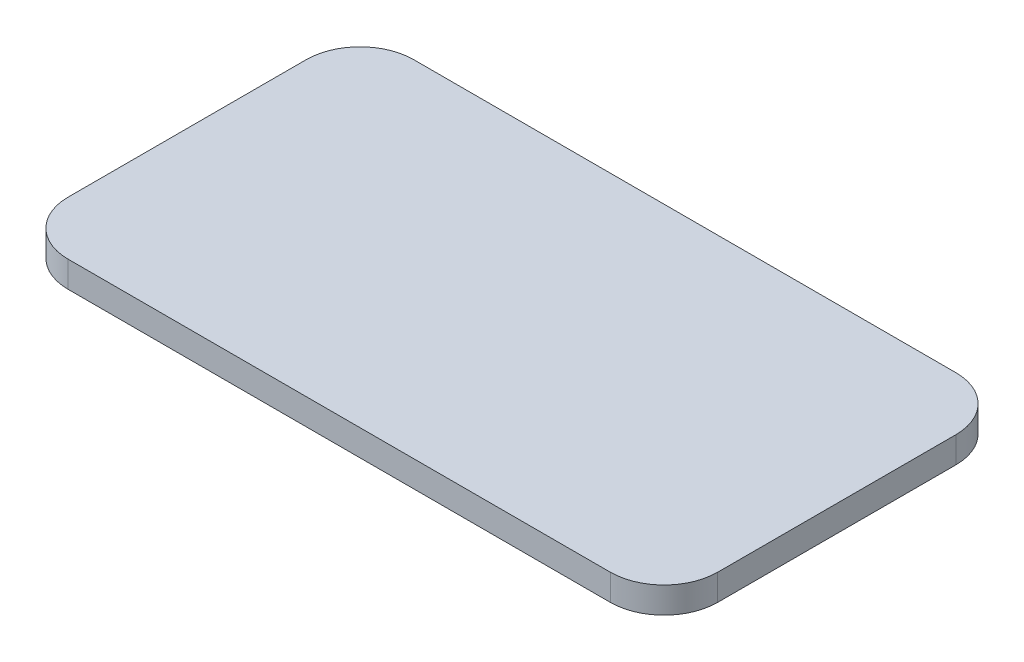
ISO-10303-21;
HEADER;
FILE_DESCRIPTION(('STEP AP214'),'2;1');
FILE_NAME('part.step','',(''),(''),'','','');
FILE_SCHEMA(('AUTOMOTIVE_DESIGN { 1 0 10303 214 1 1 1 1 }'));
ENDSEC;
DATA;
#1=APPLICATION_CONTEXT('core data for automotive mechanical design processes');
#2=APPLICATION_PROTOCOL_DEFINITION('international standard','automotive_design',2000,#1);
#3=PRODUCT_CONTEXT('',#1,'mechanical');
#4=PRODUCT('Part','Part','',(#3));
#5=PRODUCT_RELATED_PRODUCT_CATEGORY('part','',(#4));
#6=PRODUCT_DEFINITION_FORMATION('','',#4);
#7=PRODUCT_DEFINITION_CONTEXT('part definition',#1,'design');
#8=PRODUCT_DEFINITION('design','',#6,#7);
#9=PRODUCT_DEFINITION_SHAPE('','',#8);
#10=(LENGTH_UNIT() NAMED_UNIT(*) SI_UNIT(.MILLI.,.METRE.));
#11=(NAMED_UNIT(*) PLANE_ANGLE_UNIT() SI_UNIT($,.RADIAN.));
#12=(NAMED_UNIT(*) SI_UNIT($,.STERADIAN.) SOLID_ANGLE_UNIT());
#13=UNCERTAINTY_MEASURE_WITH_UNIT(LENGTH_MEASURE(1.E-05),#10,'distance_accuracy_value','');
#14=(GEOMETRIC_REPRESENTATION_CONTEXT(3) GLOBAL_UNCERTAINTY_ASSIGNED_CONTEXT((#13)) GLOBAL_UNIT_ASSIGNED_CONTEXT((#10,
#11,#12)) REPRESENTATION_CONTEXT('',''));
#15=CARTESIAN_POINT('',(0.,0.,0.));
#16=DIRECTION('',(0.,0.,1.));
#17=DIRECTION('',(1.,0.,0.));
#18=AXIS2_PLACEMENT_3D('',#15,#16,#17);
#19=CARTESIAN_POINT('',(0.,1.46,0.));
#20=DIRECTION('',(1.,0.,0.));
#21=DIRECTION('',(0.,0.,-1.));
#22=AXIS2_PLACEMENT_3D('',#19,#20,#21);
#23=PLANE('',#22);
#24=DIRECTION('',(0.,0.,1.));
#25=VECTOR('',#24,1.);
#26=CARTESIAN_POINT('',(0.,1.46,0.));
#27=LINE('',#26,#25);
#28=CARTESIAN_POINT('',(0.,1.46,-16.3));
#29=VERTEX_POINT('',#28);
#30=CARTESIAN_POINT('',(0.,1.46,-3.));
#31=VERTEX_POINT('',#30);
#32=EDGE_CURVE('E123',#29,#31,#27,.T.);
#33=ORIENTED_EDGE('',*,*,#32,.F.);
#34=DIRECTION('',(0.,-1.,0.));
#35=VECTOR('',#34,1.);
#36=CARTESIAN_POINT('',(0.,1.46,-16.3));
#37=LINE('',#36,#35);
#38=CARTESIAN_POINT('',(0.,0.,-16.3));
#39=VERTEX_POINT('',#38);
#40=EDGE_CURVE('E108',#29,#39,#37,.T.);
#41=ORIENTED_EDGE('',*,*,#40,.T.);
#42=DIRECTION('',(0.,0.,1.));
#43=VECTOR('',#42,1.);
#44=CARTESIAN_POINT('',(0.,0.,0.));
#45=LINE('',#44,#43);
#46=CARTESIAN_POINT('',(0.,0.,-3.));
#47=VERTEX_POINT('',#46);
#48=EDGE_CURVE('E120',#39,#47,#45,.T.);
#49=ORIENTED_EDGE('',*,*,#48,.T.);
#50=DIRECTION('',(0.,-1.,0.));
#51=VECTOR('',#50,1.);
#52=CARTESIAN_POINT('',(0.,1.46,-3.));
#53=LINE('',#52,#51);
#54=EDGE_CURVE('E125',#47,#31,#53,.F.);
#55=ORIENTED_EDGE('',*,*,#54,.T.);
#56=EDGE_LOOP('',(#33,#41,#49,#55));
#57=FACE_BOUND('',#56,.T.);
#58=ADVANCED_FACE('F38',(#57),#23,.F.);
#59=CARTESIAN_POINT('',(0.,1.46,0.));
#60=DIRECTION('',(0.,0.,-1.));
#61=DIRECTION('',(-1.,0.,0.));
#62=AXIS2_PLACEMENT_3D('',#59,#60,#61);
#63=PLANE('',#62);
#64=DIRECTION('',(1.,0.,0.));
#65=VECTOR('',#64,1.);
#66=CARTESIAN_POINT('',(0.,0.,0.));
#67=LINE('',#66,#65);
#68=CARTESIAN_POINT('',(3.,0.,0.));
#69=VERTEX_POINT('',#68);
#70=CARTESIAN_POINT('',(33.28,0.,0.));
#71=VERTEX_POINT('',#70);
#72=EDGE_CURVE('E129',#69,#71,#67,.T.);
#73=ORIENTED_EDGE('',*,*,#72,.T.);
#74=DIRECTION('',(0.,-1.,0.));
#75=VECTOR('',#74,1.);
#76=CARTESIAN_POINT('',(33.28,1.46,0.));
#77=LINE('',#76,#75);
#78=CARTESIAN_POINT('',(33.28,1.46,0.));
#79=VERTEX_POINT('',#78);
#80=EDGE_CURVE('E11',#71,#79,#77,.F.);
#81=ORIENTED_EDGE('',*,*,#80,.T.);
#82=DIRECTION('',(1.,0.,0.));
#83=VECTOR('',#82,1.);
#84=CARTESIAN_POINT('',(0.,1.46,0.));
#85=LINE('',#84,#83);
#86=CARTESIAN_POINT('',(3.,1.46,0.));
#87=VERTEX_POINT('',#86);
#88=EDGE_CURVE('E165',#87,#79,#85,.T.);
#89=ORIENTED_EDGE('',*,*,#88,.F.);
#90=DIRECTION('',(0.,-1.,0.));
#91=VECTOR('',#90,1.);
#92=CARTESIAN_POINT('',(3.,1.46,0.));
#93=LINE('',#92,#91);
#94=EDGE_CURVE('E46',#87,#69,#93,.T.);
#95=ORIENTED_EDGE('',*,*,#94,.T.);
#96=EDGE_LOOP('',(#73,#81,#89,#95));
#97=FACE_BOUND('',#96,.T.);
#98=ADVANCED_FACE('F163',(#97),#63,.F.);
#99=CARTESIAN_POINT('',(36.28,1.46,0.));
#100=DIRECTION('',(-1.,0.,0.));
#101=DIRECTION('',(0.,0.,1.));
#102=AXIS2_PLACEMENT_3D('',#99,#100,#101);
#103=PLANE('',#102);
#104=DIRECTION('',(0.,0.,-1.));
#105=VECTOR('',#104,1.);
#106=CARTESIAN_POINT('',(36.28,0.,0.));
#107=LINE('',#106,#105);
#108=CARTESIAN_POINT('',(36.28,0.,-3.));
#109=VERTEX_POINT('',#108);
#110=CARTESIAN_POINT('',(36.28,0.,-16.3));
#111=VERTEX_POINT('',#110);
#112=EDGE_CURVE('E132',#109,#111,#107,.T.);
#113=ORIENTED_EDGE('',*,*,#112,.T.);
#114=DIRECTION('',(0.,-1.,0.));
#115=VECTOR('',#114,1.);
#116=CARTESIAN_POINT('',(36.28,1.46,-16.3));
#117=LINE('',#116,#115);
#118=CARTESIAN_POINT('',(36.28,1.46,-16.3));
#119=VERTEX_POINT('',#118);
#120=EDGE_CURVE('E53',#111,#119,#117,.F.);
#121=ORIENTED_EDGE('',*,*,#120,.T.);
#122=DIRECTION('',(0.,0.,-1.));
#123=VECTOR('',#122,1.);
#124=CARTESIAN_POINT('',(36.28,1.46,0.));
#125=LINE('',#124,#123);
#126=CARTESIAN_POINT('',(36.28,1.46,-3.));
#127=VERTEX_POINT('',#126);
#128=EDGE_CURVE('E173',#127,#119,#125,.T.);
#129=ORIENTED_EDGE('',*,*,#128,.F.);
#130=DIRECTION('',(0.,-1.,0.));
#131=VECTOR('',#130,1.);
#132=CARTESIAN_POINT('',(36.28,1.46,-3.));
#133=LINE('',#132,#131);
#134=EDGE_CURVE('E156',#127,#109,#133,.T.);
#135=ORIENTED_EDGE('',*,*,#134,.T.);
#136=EDGE_LOOP('',(#113,#121,#129,#135));
#137=FACE_BOUND('',#136,.T.);
#138=ADVANCED_FACE('F172',(#137),#103,.F.);
#139=CARTESIAN_POINT('',(0.,1.46,-19.3));
#140=DIRECTION('',(0.,0.,1.));
#141=DIRECTION('',(1.,0.,0.));
#142=AXIS2_PLACEMENT_3D('',#139,#140,#141);
#143=PLANE('',#142);
#144=DIRECTION('',(-1.,0.,0.));
#145=VECTOR('',#144,1.);
#146=CARTESIAN_POINT('',(0.,0.,-19.3));
#147=LINE('',#146,#145);
#148=CARTESIAN_POINT('',(33.28,0.,-19.3));
#149=VERTEX_POINT('',#148);
#150=CARTESIAN_POINT('',(3.,0.,-19.3));
#151=VERTEX_POINT('',#150);
#152=EDGE_CURVE('E139',#149,#151,#147,.T.);
#153=ORIENTED_EDGE('',*,*,#152,.T.);
#154=DIRECTION('',(0.,-1.,0.));
#155=VECTOR('',#154,1.);
#156=CARTESIAN_POINT('',(3.,1.46,-19.3));
#157=LINE('',#156,#155);
#158=CARTESIAN_POINT('',(3.,1.46,-19.3));
#159=VERTEX_POINT('',#158);
#160=EDGE_CURVE('E109',#151,#159,#157,.F.);
#161=ORIENTED_EDGE('',*,*,#160,.T.);
#162=DIRECTION('',(-1.,0.,0.));
#163=VECTOR('',#162,1.);
#164=CARTESIAN_POINT('',(0.,1.46,-19.3));
#165=LINE('',#164,#163);
#166=CARTESIAN_POINT('',(33.28,1.46,-19.3));
#167=VERTEX_POINT('',#166);
#168=EDGE_CURVE('E135',#167,#159,#165,.T.);
#169=ORIENTED_EDGE('',*,*,#168,.F.);
#170=DIRECTION('',(0.,-1.,0.));
#171=VECTOR('',#170,1.);
#172=CARTESIAN_POINT('',(33.28,1.46,-19.3));
#173=LINE('',#172,#171);
#174=EDGE_CURVE('E114',#167,#149,#173,.T.);
#175=ORIENTED_EDGE('',*,*,#174,.T.);
#176=EDGE_LOOP('',(#153,#161,#169,#175));
#177=FACE_BOUND('',#176,.T.);
#178=ADVANCED_FACE('F201',(#177),#143,.F.);
#179=CARTESIAN_POINT('',(0.,1.46,0.));
#180=DIRECTION('',(0.,-1.,0.));
#181=DIRECTION('',(0.,0.,-1.));
#182=AXIS2_PLACEMENT_3D('',#179,#180,#181);
#183=PLANE('',#182);
#184=ORIENTED_EDGE('',*,*,#168,.T.);
#185=CARTESIAN_POINT('',(3.,1.46,-16.3));
#186=DIRECTION('',(0.,-1.,0.));
#187=DIRECTION('',(0.,0.,-1.));
#188=AXIS2_PLACEMENT_3D('',#185,#186,#187);
#189=CIRCLE('',#188,3.);
#190=EDGE_CURVE('E154',#159,#29,#189,.F.);
#191=ORIENTED_EDGE('',*,*,#190,.T.);
#192=ORIENTED_EDGE('',*,*,#32,.T.);
#193=CARTESIAN_POINT('',(3.,1.46,-3.));
#194=DIRECTION('',(0.,-1.,0.));
#195=DIRECTION('',(0.,0.,-1.));
#196=AXIS2_PLACEMENT_3D('',#193,#194,#195);
#197=CIRCLE('',#196,3.);
#198=EDGE_CURVE('E149',#31,#87,#197,.F.);
#199=ORIENTED_EDGE('',*,*,#198,.T.);
#200=ORIENTED_EDGE('',*,*,#88,.T.);
#201=CARTESIAN_POINT('',(33.28,1.46,-3.));
#202=DIRECTION('',(0.,-1.,0.));
#203=DIRECTION('',(0.,0.,-1.));
#204=AXIS2_PLACEMENT_3D('',#201,#202,#203);
#205=CIRCLE('',#204,3.);
#206=EDGE_CURVE('E60',#79,#127,#205,.F.);
#207=ORIENTED_EDGE('',*,*,#206,.T.);
#208=ORIENTED_EDGE('',*,*,#128,.T.);
#209=CARTESIAN_POINT('',(33.28,1.46,-16.3));
#210=DIRECTION('',(0.,-1.,0.));
#211=DIRECTION('',(0.,0.,-1.));
#212=AXIS2_PLACEMENT_3D('',#209,#210,#211);
#213=CIRCLE('',#212,3.);
#214=EDGE_CURVE('E152',#119,#167,#213,.F.);
#215=ORIENTED_EDGE('',*,*,#214,.T.);
#216=EDGE_LOOP('',(#184,#191,#192,#199,#200,#207,#208,#215));
#217=FACE_BOUND('',#216,.T.);
#218=ADVANCED_FACE('F178',(#217),#183,.F.);
#219=CARTESIAN_POINT('',(0.,0.,0.));
#220=DIRECTION('',(0.,-1.,0.));
#221=DIRECTION('',(0.,0.,-1.));
#222=AXIS2_PLACEMENT_3D('',#219,#220,#221);
#223=PLANE('',#222);
#224=ORIENTED_EDGE('',*,*,#48,.F.);
#225=CARTESIAN_POINT('',(3.,0.,-16.3));
#226=DIRECTION('',(0.,-1.,0.));
#227=DIRECTION('',(0.,0.,-1.));
#228=AXIS2_PLACEMENT_3D('',#225,#226,#227);
#229=CIRCLE('',#228,3.);
#230=EDGE_CURVE('E104',#39,#151,#229,.T.);
#231=ORIENTED_EDGE('',*,*,#230,.T.);
#232=ORIENTED_EDGE('',*,*,#152,.F.);
#233=CARTESIAN_POINT('',(33.28,0.,-16.3));
#234=DIRECTION('',(0.,-1.,0.));
#235=DIRECTION('',(0.,0.,-1.));
#236=AXIS2_PLACEMENT_3D('',#233,#234,#235);
#237=CIRCLE('',#236,3.);
#238=EDGE_CURVE('E115',#149,#111,#237,.T.);
#239=ORIENTED_EDGE('',*,*,#238,.T.);
#240=ORIENTED_EDGE('',*,*,#112,.F.);
#241=CARTESIAN_POINT('',(33.28,0.,-3.));
#242=DIRECTION('',(0.,-1.,0.));
#243=DIRECTION('',(0.,0.,-1.));
#244=AXIS2_PLACEMENT_3D('',#241,#242,#243);
#245=CIRCLE('',#244,3.);
#246=EDGE_CURVE('E143',#109,#71,#245,.T.);
#247=ORIENTED_EDGE('',*,*,#246,.T.);
#248=ORIENTED_EDGE('',*,*,#72,.F.);
#249=CARTESIAN_POINT('',(3.,0.,-3.));
#250=DIRECTION('',(0.,-1.,0.));
#251=DIRECTION('',(0.,0.,-1.));
#252=AXIS2_PLACEMENT_3D('',#249,#250,#251);
#253=CIRCLE('',#252,3.);
#254=EDGE_CURVE('E124',#69,#47,#253,.T.);
#255=ORIENTED_EDGE('',*,*,#254,.T.);
#256=EDGE_LOOP('',(#224,#231,#232,#239,#240,#247,#248,#255));
#257=FACE_BOUND('',#256,.T.);
#258=ADVANCED_FACE('F127',(#257),#223,.T.);
#259=CARTESIAN_POINT('',(3.,1.46,-16.3));
#260=DIRECTION('',(0.,-1.,0.));
#261=DIRECTION('',(0.,0.,-1.));
#262=AXIS2_PLACEMENT_3D('',#259,#260,#261);
#263=CYLINDRICAL_SURFACE('',#262,3.);
#264=ORIENTED_EDGE('',*,*,#190,.F.);
#265=ORIENTED_EDGE('',*,*,#160,.F.);
#266=ORIENTED_EDGE('',*,*,#230,.F.);
#267=ORIENTED_EDGE('',*,*,#40,.F.);
#268=EDGE_LOOP('',(#264,#265,#266,#267));
#269=FACE_BOUND('',#268,.T.);
#270=ADVANCED_FACE('F107',(#269),#263,.T.);
#271=CARTESIAN_POINT('',(33.28,1.46,-16.3));
#272=DIRECTION('',(0.,-1.,0.));
#273=DIRECTION('',(0.,0.,-1.));
#274=AXIS2_PLACEMENT_3D('',#271,#272,#273);
#275=CYLINDRICAL_SURFACE('',#274,3.);
#276=ORIENTED_EDGE('',*,*,#214,.F.);
#277=ORIENTED_EDGE('',*,*,#120,.F.);
#278=ORIENTED_EDGE('',*,*,#238,.F.);
#279=ORIENTED_EDGE('',*,*,#174,.F.);
#280=EDGE_LOOP('',(#276,#277,#278,#279));
#281=FACE_BOUND('',#280,.T.);
#282=ADVANCED_FACE('F183',(#281),#275,.T.);
#283=CARTESIAN_POINT('',(33.28,1.46,-3.));
#284=DIRECTION('',(0.,-1.,0.));
#285=DIRECTION('',(0.,0.,-1.));
#286=AXIS2_PLACEMENT_3D('',#283,#284,#285);
#287=CYLINDRICAL_SURFACE('',#286,3.);
#288=ORIENTED_EDGE('',*,*,#206,.F.);
#289=ORIENTED_EDGE('',*,*,#80,.F.);
#290=ORIENTED_EDGE('',*,*,#246,.F.);
#291=ORIENTED_EDGE('',*,*,#134,.F.);
#292=EDGE_LOOP('',(#288,#289,#290,#291));
#293=FACE_BOUND('',#292,.T.);
#294=ADVANCED_FACE('F171',(#293),#287,.T.);
#295=CARTESIAN_POINT('',(3.,1.46,-3.));
#296=DIRECTION('',(0.,-1.,0.));
#297=DIRECTION('',(0.,0.,-1.));
#298=AXIS2_PLACEMENT_3D('',#295,#296,#297);
#299=CYLINDRICAL_SURFACE('',#298,3.);
#300=ORIENTED_EDGE('',*,*,#198,.F.);
#301=ORIENTED_EDGE('',*,*,#54,.F.);
#302=ORIENTED_EDGE('',*,*,#254,.F.);
#303=ORIENTED_EDGE('',*,*,#94,.F.);
#304=EDGE_LOOP('',(#300,#301,#302,#303));
#305=FACE_BOUND('',#304,.T.);
#306=ADVANCED_FACE('F40',(#305),#299,.T.);
#307=CLOSED_SHELL('',(#58,#98,#138,#178,#218,#258,#270,#282,#294,#306));
#308=MANIFOLD_SOLID_BREP('B2',#307);
#309=ADVANCED_BREP_SHAPE_REPRESENTATION('',(#18,#308),#14);
#310=SHAPE_DEFINITION_REPRESENTATION(#9,#309);
ENDSEC;
END-ISO-10303-21;
